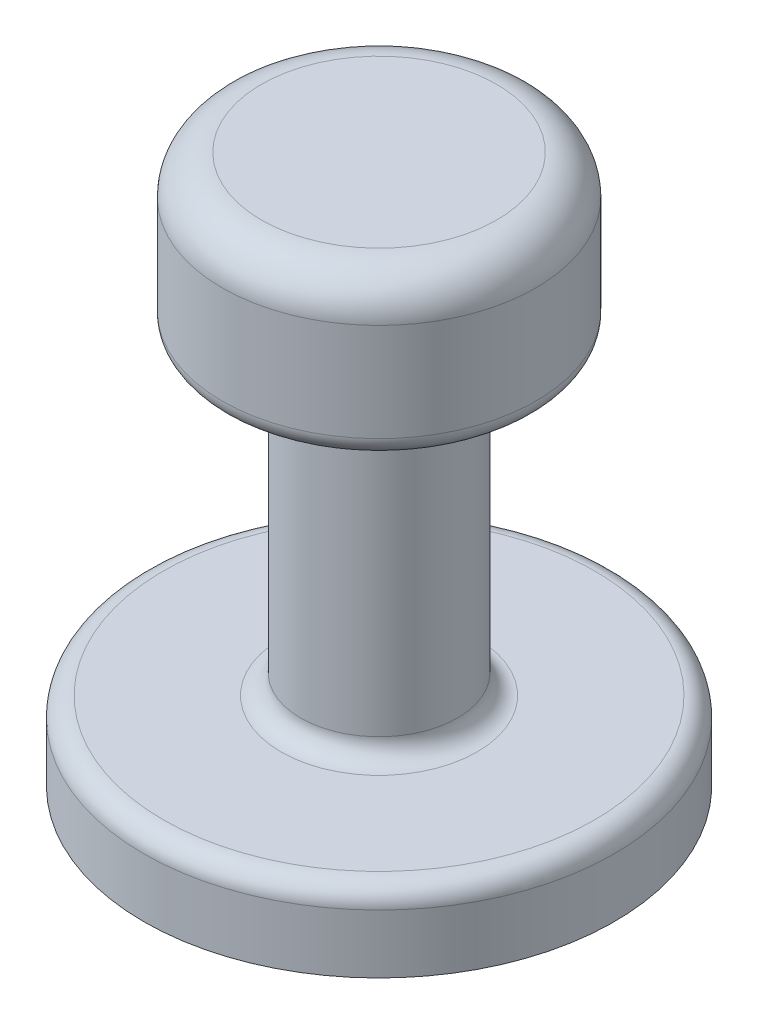
ISO-10303-21;
HEADER;
FILE_DESCRIPTION(('STEP AP214'),'2;1');
FILE_NAME('part.step','',(''),(''),'','','');
FILE_SCHEMA(('AUTOMOTIVE_DESIGN { 1 0 10303 214 1 1 1 1 }'));
ENDSEC;
DATA;
#1=APPLICATION_CONTEXT('core data for automotive mechanical design processes');
#2=APPLICATION_PROTOCOL_DEFINITION('international standard','automotive_design',2000,#1);
#3=PRODUCT_CONTEXT('',#1,'mechanical');
#4=PRODUCT('Part','Part','',(#3));
#5=PRODUCT_RELATED_PRODUCT_CATEGORY('part','',(#4));
#6=PRODUCT_DEFINITION_FORMATION('','',#4);
#7=PRODUCT_DEFINITION_CONTEXT('part definition',#1,'design');
#8=PRODUCT_DEFINITION('design','',#6,#7);
#9=PRODUCT_DEFINITION_SHAPE('','',#8);
#10=(LENGTH_UNIT() NAMED_UNIT(*) SI_UNIT(.MILLI.,.METRE.));
#11=(NAMED_UNIT(*) PLANE_ANGLE_UNIT() SI_UNIT($,.RADIAN.));
#12=(NAMED_UNIT(*) SI_UNIT($,.STERADIAN.) SOLID_ANGLE_UNIT());
#13=UNCERTAINTY_MEASURE_WITH_UNIT(LENGTH_MEASURE(1.E-05),#10,'distance_accuracy_value','');
#14=(GEOMETRIC_REPRESENTATION_CONTEXT(3) GLOBAL_UNCERTAINTY_ASSIGNED_CONTEXT((#13)) GLOBAL_UNIT_ASSIGNED_CONTEXT((#10,
#11,#12)) REPRESENTATION_CONTEXT('',''));
#15=CARTESIAN_POINT('',(0.,0.,0.));
#16=DIRECTION('',(0.,0.,1.));
#17=DIRECTION('',(1.,0.,0.));
#18=AXIS2_PLACEMENT_3D('',#15,#16,#17);
#19=CARTESIAN_POINT('',(0.,7.,0.));
#20=DIRECTION('',(0.,-1.,0.));
#21=DIRECTION('',(0.,0.,-1.));
#22=AXIS2_PLACEMENT_3D('',#19,#20,#21);
#23=CYLINDRICAL_SURFACE('',#22,2.);
#24=CARTESIAN_POINT('',(0.,5.25,0.));
#25=DIRECTION('',(0.,1.,0.));
#26=DIRECTION('',(0.,0.,1.));
#27=AXIS2_PLACEMENT_3D('',#24,#25,#26);
#28=CIRCLE('',#27,2.);
#29=CARTESIAN_POINT('',(0.,5.25,2.));
#30=VERTEX_POINT('',#29);
#31=EDGE_CURVE('E56',#30,#30,#28,.T.);
#32=ORIENTED_EDGE('',*,*,#31,.T.);
#33=EDGE_LOOP('',(#32));
#34=FACE_BOUND('',#33,.T.);
#35=CARTESIAN_POINT('',(0.,6.5,0.));
#36=DIRECTION('',(0.,1.,0.));
#37=DIRECTION('',(0.,0.,1.));
#38=AXIS2_PLACEMENT_3D('',#35,#36,#37);
#39=CIRCLE('',#38,2.);
#40=CARTESIAN_POINT('',(0.,6.5,2.));
#41=VERTEX_POINT('',#40);
#42=EDGE_CURVE('E65',#41,#41,#39,.F.);
#43=ORIENTED_EDGE('',*,*,#42,.T.);
#44=EDGE_LOOP('',(#43));
#45=FACE_BOUND('',#44,.T.);
#46=ADVANCED_FACE('F33',(#34,#45),#23,.T.);
#47=CARTESIAN_POINT('',(0.,7.,0.));
#48=DIRECTION('',(0.,1.,0.));
#49=DIRECTION('',(0.,0.,1.));
#50=AXIS2_PLACEMENT_3D('',#47,#48,#49);
#51=PLANE('',#50);
#52=CARTESIAN_POINT('',(0.,7.,0.));
#53=DIRECTION('',(0.,1.,0.));
#54=DIRECTION('',(0.,0.,1.));
#55=AXIS2_PLACEMENT_3D('',#52,#53,#54);
#56=CIRCLE('',#55,1.5);
#57=CARTESIAN_POINT('',(0.,7.,1.5));
#58=VERTEX_POINT('',#57);
#59=EDGE_CURVE('E68',#58,#58,#56,.T.);
#60=ORIENTED_EDGE('',*,*,#59,.T.);
#61=EDGE_LOOP('',(#60));
#62=FACE_BOUND('',#61,.T.);
#63=ADVANCED_FACE('F93',(#62),#51,.T.);
#64=CARTESIAN_POINT('',(0.,5.,0.));
#65=DIRECTION('',(0.,-1.,0.));
#66=DIRECTION('',(0.,0.,-1.));
#67=AXIS2_PLACEMENT_3D('',#64,#65,#66);
#68=CYLINDRICAL_SURFACE('',#67,1.);
#69=CARTESIAN_POINT('',(0.,1.25,0.));
#70=DIRECTION('',(0.,1.,0.));
#71=DIRECTION('',(0.,0.,1.));
#72=AXIS2_PLACEMENT_3D('',#69,#70,#71);
#73=CIRCLE('',#72,1.);
#74=CARTESIAN_POINT('',(0.,1.25,1.));
#75=VERTEX_POINT('',#74);
#76=EDGE_CURVE('E40',#75,#75,#73,.T.);
#77=ORIENTED_EDGE('',*,*,#76,.T.);
#78=EDGE_LOOP('',(#77));
#79=FACE_BOUND('',#78,.T.);
#80=CARTESIAN_POINT('',(0.,4.75,0.));
#81=DIRECTION('',(0.,1.,0.));
#82=DIRECTION('',(0.,0.,1.));
#83=AXIS2_PLACEMENT_3D('',#80,#81,#82);
#84=CIRCLE('',#83,1.);
#85=CARTESIAN_POINT('',(0.,4.75,1.));
#86=VERTEX_POINT('',#85);
#87=EDGE_CURVE('E44',#86,#86,#84,.F.);
#88=ORIENTED_EDGE('',*,*,#87,.T.);
#89=EDGE_LOOP('',(#88));
#90=FACE_BOUND('',#89,.T.);
#91=ADVANCED_FACE('F98',(#79,#90),#68,.T.);
#92=CARTESIAN_POINT('',(0.,5.,0.));
#93=DIRECTION('',(0.,1.,0.));
#94=DIRECTION('',(0.,0.,1.));
#95=AXIS2_PLACEMENT_3D('',#92,#93,#94);
#96=PLANE('',#95);
#97=CARTESIAN_POINT('',(0.,5.,0.));
#98=DIRECTION('',(0.,1.,0.));
#99=DIRECTION('',(0.,0.,1.));
#100=AXIS2_PLACEMENT_3D('',#97,#98,#99);
#101=CIRCLE('',#100,1.75);
#102=CARTESIAN_POINT('',(0.,5.,1.75));
#103=VERTEX_POINT('',#102);
#104=EDGE_CURVE('E48',#103,#103,#101,.F.);
#105=ORIENTED_EDGE('',*,*,#104,.T.);
#106=EDGE_LOOP('',(#105));
#107=FACE_BOUND('',#106,.T.);
#108=CARTESIAN_POINT('',(0.,5.,0.));
#109=DIRECTION('',(0.,1.,0.));
#110=DIRECTION('',(0.,0.,1.));
#111=AXIS2_PLACEMENT_3D('',#108,#109,#110);
#112=CIRCLE('',#111,1.25);
#113=CARTESIAN_POINT('',(0.,5.,1.25));
#114=VERTEX_POINT('',#113);
#115=EDGE_CURVE('E53',#114,#114,#112,.T.);
#116=ORIENTED_EDGE('',*,*,#115,.T.);
#117=EDGE_LOOP('',(#116));
#118=FACE_BOUND('',#117,.T.);
#119=ADVANCED_FACE('F119',(#107,#118),#96,.F.);
#120=CARTESIAN_POINT('',(0.,1.,0.));
#121=DIRECTION('',(0.,-1.,0.));
#122=DIRECTION('',(0.,0.,-1.));
#123=AXIS2_PLACEMENT_3D('',#120,#121,#122);
#124=CYLINDRICAL_SURFACE('',#123,3.);
#125=CARTESIAN_POINT('',(0.,0.75,0.));
#126=DIRECTION('',(0.,1.,0.));
#127=DIRECTION('',(0.,0.,1.));
#128=AXIS2_PLACEMENT_3D('',#125,#126,#127);
#129=CIRCLE('',#128,3.);
#130=CARTESIAN_POINT('',(0.,0.75,3.));
#131=VERTEX_POINT('',#130);
#132=EDGE_CURVE('E59',#131,#131,#129,.F.);
#133=ORIENTED_EDGE('',*,*,#132,.T.);
#134=EDGE_LOOP('',(#133));
#135=FACE_BOUND('',#134,.T.);
#136=CARTESIAN_POINT('',(0.,0.,0.));
#137=DIRECTION('',(0.,1.,0.));
#138=DIRECTION('',(0.,0.,1.));
#139=AXIS2_PLACEMENT_3D('',#136,#137,#138);
#140=CIRCLE('',#139,3.);
#141=CARTESIAN_POINT('',(0.,0.,3.));
#142=VERTEX_POINT('',#141);
#143=EDGE_CURVE('E71',#142,#142,#140,.T.);
#144=ORIENTED_EDGE('',*,*,#143,.T.);
#145=EDGE_LOOP('',(#144));
#146=FACE_BOUND('',#145,.T.);
#147=ADVANCED_FACE('F75',(#135,#146),#124,.T.);
#148=CARTESIAN_POINT('',(0.,1.,0.));
#149=DIRECTION('',(0.,1.,0.));
#150=DIRECTION('',(0.,0.,1.));
#151=AXIS2_PLACEMENT_3D('',#148,#149,#150);
#152=PLANE('',#151);
#153=CARTESIAN_POINT('',(0.,1.,0.));
#154=DIRECTION('',(0.,1.,0.));
#155=DIRECTION('',(0.,0.,1.));
#156=AXIS2_PLACEMENT_3D('',#153,#154,#155);
#157=CIRCLE('',#156,1.25);
#158=CARTESIAN_POINT('',(0.,1.,1.25));
#159=VERTEX_POINT('',#158);
#160=EDGE_CURVE('E10',#159,#159,#157,.F.);
#161=ORIENTED_EDGE('',*,*,#160,.T.);
#162=EDGE_LOOP('',(#161));
#163=FACE_BOUND('',#162,.T.);
#164=CARTESIAN_POINT('',(0.,1.,0.));
#165=DIRECTION('',(0.,1.,0.));
#166=DIRECTION('',(0.,0.,1.));
#167=AXIS2_PLACEMENT_3D('',#164,#165,#166);
#168=CIRCLE('',#167,2.75);
#169=CARTESIAN_POINT('',(0.,1.,2.75));
#170=VERTEX_POINT('',#169);
#171=EDGE_CURVE('E62',#170,#170,#168,.T.);
#172=ORIENTED_EDGE('',*,*,#171,.T.);
#173=EDGE_LOOP('',(#172));
#174=FACE_BOUND('',#173,.T.);
#175=ADVANCED_FACE('F80',(#163,#174),#152,.T.);
#176=CARTESIAN_POINT('',(0.,0.,0.));
#177=DIRECTION('',(0.,1.,0.));
#178=DIRECTION('',(0.,0.,1.));
#179=AXIS2_PLACEMENT_3D('',#176,#177,#178);
#180=PLANE('',#179);
#181=ORIENTED_EDGE('',*,*,#143,.F.);
#182=EDGE_LOOP('',(#181));
#183=FACE_BOUND('',#182,.T.);
#184=ADVANCED_FACE('F77',(#183),#180,.F.);
#185=CARTESIAN_POINT('',(0.,6.5,0.));
#186=DIRECTION('',(0.,1.,0.));
#187=DIRECTION('',(0.,0.,1.));
#188=AXIS2_PLACEMENT_3D('',#185,#186,#187);
#189=TOROIDAL_SURFACE('',#188,1.5,0.5);
#190=ORIENTED_EDGE('',*,*,#42,.F.);
#191=EDGE_LOOP('',(#190));
#192=FACE_BOUND('',#191,.T.);
#193=ORIENTED_EDGE('',*,*,#59,.F.);
#194=EDGE_LOOP('',(#193));
#195=FACE_BOUND('',#194,.T.);
#196=ADVANCED_FACE('F79',(#192,#195),#189,.T.);
#197=CARTESIAN_POINT('',(0.,0.75,0.));
#198=DIRECTION('',(0.,1.,0.));
#199=DIRECTION('',(0.,0.,1.));
#200=AXIS2_PLACEMENT_3D('',#197,#198,#199);
#201=TOROIDAL_SURFACE('',#200,2.75,0.25);
#202=ORIENTED_EDGE('',*,*,#132,.F.);
#203=EDGE_LOOP('',(#202));
#204=FACE_BOUND('',#203,.T.);
#205=ORIENTED_EDGE('',*,*,#171,.F.);
#206=EDGE_LOOP('',(#205));
#207=FACE_BOUND('',#206,.T.);
#208=ADVANCED_FACE('F86',(#204,#207),#201,.T.);
#209=CARTESIAN_POINT('',(0.,5.25,0.));
#210=DIRECTION('',(0.,1.,0.));
#211=DIRECTION('',(0.,0.,1.));
#212=AXIS2_PLACEMENT_3D('',#209,#210,#211);
#213=TOROIDAL_SURFACE('',#212,1.75,0.25);
#214=ORIENTED_EDGE('',*,*,#104,.F.);
#215=EDGE_LOOP('',(#214));
#216=FACE_BOUND('',#215,.T.);
#217=ORIENTED_EDGE('',*,*,#31,.F.);
#218=EDGE_LOOP('',(#217));
#219=FACE_BOUND('',#218,.T.);
#220=ADVANCED_FACE('F104',(#216,#219),#213,.T.);
#221=CARTESIAN_POINT('',(0.,4.75,0.));
#222=DIRECTION('',(0.,1.,0.));
#223=DIRECTION('',(0.,0.,1.));
#224=AXIS2_PLACEMENT_3D('',#221,#222,#223);
#225=TOROIDAL_SURFACE('',#224,1.25,0.25);
#226=ORIENTED_EDGE('',*,*,#87,.F.);
#227=EDGE_LOOP('',(#226));
#228=FACE_BOUND('',#227,.T.);
#229=ORIENTED_EDGE('',*,*,#115,.F.);
#230=EDGE_LOOP('',(#229));
#231=FACE_BOUND('',#230,.T.);
#232=ADVANCED_FACE('F107',(#228,#231),#225,.F.);
#233=CARTESIAN_POINT('',(0.,1.25,0.));
#234=DIRECTION('',(0.,1.,0.));
#235=DIRECTION('',(0.,0.,1.));
#236=AXIS2_PLACEMENT_3D('',#233,#234,#235);
#237=TOROIDAL_SURFACE('',#236,1.25,0.25);
#238=ORIENTED_EDGE('',*,*,#160,.F.);
#239=EDGE_LOOP('',(#238));
#240=FACE_BOUND('',#239,.T.);
#241=ORIENTED_EDGE('',*,*,#76,.F.);
#242=EDGE_LOOP('',(#241));
#243=FACE_BOUND('',#242,.T.);
#244=ADVANCED_FACE('F35',(#240,#243),#237,.F.);
#245=CLOSED_SHELL('',(#46,#63,#91,#119,#147,#175,#184,#196,#208,#220,#232,#244));
#246=MANIFOLD_SOLID_BREP('B2',#245);
#247=ADVANCED_BREP_SHAPE_REPRESENTATION('',(#18,#246),#14);
#248=SHAPE_DEFINITION_REPRESENTATION(#9,#247);
ENDSEC;
END-ISO-10303-21;
